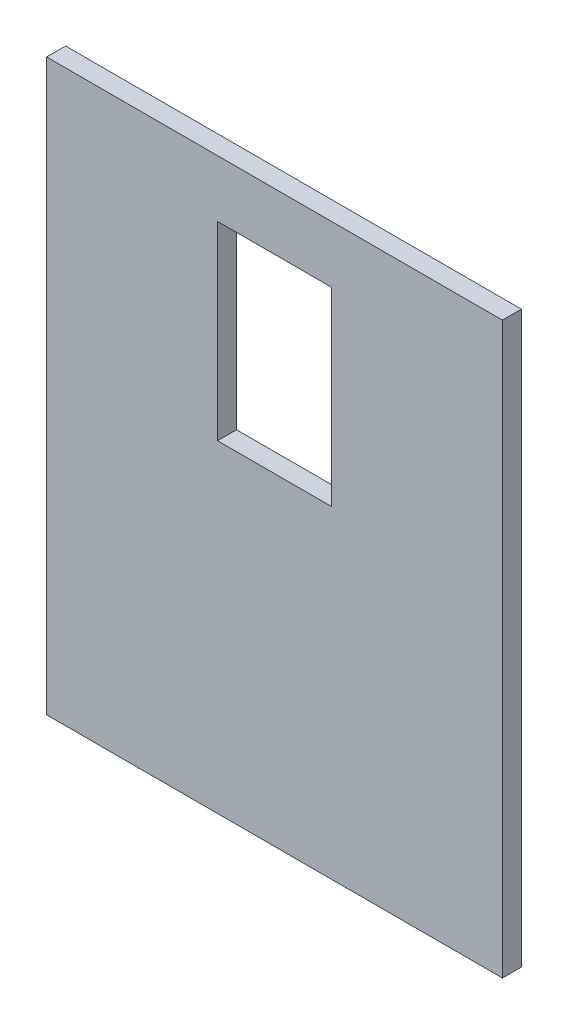
ISO-10303-21;
HEADER;
FILE_DESCRIPTION(('STEP AP214'),'2;1');
FILE_NAME('part.step','',(''),(''),'','','');
FILE_SCHEMA(('AUTOMOTIVE_DESIGN { 1 0 10303 214 1 1 1 1 }'));
ENDSEC;
DATA;
#1=APPLICATION_CONTEXT('core data for automotive mechanical design processes');
#2=APPLICATION_PROTOCOL_DEFINITION('international standard','automotive_design',2000,#1);
#3=PRODUCT_CONTEXT('',#1,'mechanical');
#4=PRODUCT('Part','Part','',(#3));
#5=PRODUCT_RELATED_PRODUCT_CATEGORY('part','',(#4));
#6=PRODUCT_DEFINITION_FORMATION('','',#4);
#7=PRODUCT_DEFINITION_CONTEXT('part definition',#1,'design');
#8=PRODUCT_DEFINITION('design','',#6,#7);
#9=PRODUCT_DEFINITION_SHAPE('','',#8);
#10=(LENGTH_UNIT() NAMED_UNIT(*) SI_UNIT(.MILLI.,.METRE.));
#11=(NAMED_UNIT(*) PLANE_ANGLE_UNIT() SI_UNIT($,.RADIAN.));
#12=(NAMED_UNIT(*) SI_UNIT($,.STERADIAN.) SOLID_ANGLE_UNIT());
#13=UNCERTAINTY_MEASURE_WITH_UNIT(LENGTH_MEASURE(1.E-05),#10,'distance_accuracy_value','');
#14=(GEOMETRIC_REPRESENTATION_CONTEXT(3) GLOBAL_UNCERTAINTY_ASSIGNED_CONTEXT((#13)) GLOBAL_UNIT_ASSIGNED_CONTEXT((#10,
#11,#12)) REPRESENTATION_CONTEXT('',''));
#15=CARTESIAN_POINT('',(0.,0.,0.));
#16=DIRECTION('',(0.,0.,1.));
#17=DIRECTION('',(1.,0.,0.));
#18=AXIS2_PLACEMENT_3D('',#15,#16,#17);
#19=CARTESIAN_POINT('',(60.,-75.,-5.));
#20=DIRECTION('',(1.,0.,0.));
#21=DIRECTION('',(0.,0.,-1.));
#22=AXIS2_PLACEMENT_3D('',#19,#20,#21);
#23=PLANE('',#22);
#24=DIRECTION('',(0.,1.,0.));
#25=VECTOR('',#24,1.);
#26=CARTESIAN_POINT('',(60.,-75.,0.));
#27=LINE('',#26,#25);
#28=CARTESIAN_POINT('',(60.,-75.,0.));
#29=VERTEX_POINT('',#28);
#30=CARTESIAN_POINT('',(60.,75.,0.));
#31=VERTEX_POINT('',#30);
#32=EDGE_CURVE('E148',#29,#31,#27,.T.);
#33=ORIENTED_EDGE('',*,*,#32,.F.);
#34=DIRECTION('',(0.,0.,1.));
#35=VECTOR('',#34,1.);
#36=CARTESIAN_POINT('',(60.,-75.,-5.));
#37=LINE('',#36,#35);
#38=CARTESIAN_POINT('',(60.,-75.,-5.));
#39=VERTEX_POINT('',#38);
#40=EDGE_CURVE('E11',#39,#29,#37,.T.);
#41=ORIENTED_EDGE('',*,*,#40,.F.);
#42=DIRECTION('',(0.,1.,0.));
#43=VECTOR('',#42,1.);
#44=CARTESIAN_POINT('',(60.,-75.,-5.));
#45=LINE('',#44,#43);
#46=CARTESIAN_POINT('',(60.,75.,-5.));
#47=VERTEX_POINT('',#46);
#48=EDGE_CURVE('E154',#39,#47,#45,.T.);
#49=ORIENTED_EDGE('',*,*,#48,.T.);
#50=DIRECTION('',(0.,0.,1.));
#51=VECTOR('',#50,1.);
#52=CARTESIAN_POINT('',(60.,75.,-5.));
#53=LINE('',#52,#51);
#54=EDGE_CURVE('E42',#47,#31,#53,.T.);
#55=ORIENTED_EDGE('',*,*,#54,.T.);
#56=EDGE_LOOP('',(#33,#41,#49,#55));
#57=FACE_BOUND('',#56,.T.);
#58=ADVANCED_FACE('F39',(#57),#23,.T.);
#59=CARTESIAN_POINT('',(-60.,-75.,-5.));
#60=DIRECTION('',(0.,-1.,0.));
#61=DIRECTION('',(0.,0.,-1.));
#62=AXIS2_PLACEMENT_3D('',#59,#60,#61);
#63=PLANE('',#62);
#64=DIRECTION('',(1.,0.,0.));
#65=VECTOR('',#64,1.);
#66=CARTESIAN_POINT('',(-60.,-75.,0.));
#67=LINE('',#66,#65);
#68=CARTESIAN_POINT('',(-60.,-75.,0.));
#69=VERTEX_POINT('',#68);
#70=EDGE_CURVE('E159',#69,#29,#67,.T.);
#71=ORIENTED_EDGE('',*,*,#70,.F.);
#72=DIRECTION('',(0.,0.,1.));
#73=VECTOR('',#72,1.);
#74=CARTESIAN_POINT('',(-60.,-75.,-5.));
#75=LINE('',#74,#73);
#76=CARTESIAN_POINT('',(-60.,-75.,-5.));
#77=VERTEX_POINT('',#76);
#78=EDGE_CURVE('E48',#77,#69,#75,.T.);
#79=ORIENTED_EDGE('',*,*,#78,.F.);
#80=DIRECTION('',(1.,0.,0.));
#81=VECTOR('',#80,1.);
#82=CARTESIAN_POINT('',(-60.,-75.,-5.));
#83=LINE('',#82,#81);
#84=EDGE_CURVE('E167',#77,#39,#83,.T.);
#85=ORIENTED_EDGE('',*,*,#84,.T.);
#86=ORIENTED_EDGE('',*,*,#40,.T.);
#87=EDGE_LOOP('',(#71,#79,#85,#86));
#88=FACE_BOUND('',#87,.T.);
#89=ADVANCED_FACE('F201',(#88),#63,.T.);
#90=CARTESIAN_POINT('',(-60.,-75.,-5.));
#91=DIRECTION('',(-1.,0.,0.));
#92=DIRECTION('',(0.,0.,1.));
#93=AXIS2_PLACEMENT_3D('',#90,#91,#92);
#94=PLANE('',#93);
#95=DIRECTION('',(0.,-1.,0.));
#96=VECTOR('',#95,1.);
#97=CARTESIAN_POINT('',(-60.,-75.,0.));
#98=LINE('',#97,#96);
#99=CARTESIAN_POINT('',(-60.,75.,0.));
#100=VERTEX_POINT('',#99);
#101=EDGE_CURVE('E178',#100,#69,#98,.T.);
#102=ORIENTED_EDGE('',*,*,#101,.F.);
#103=DIRECTION('',(0.,0.,1.));
#104=VECTOR('',#103,1.);
#105=CARTESIAN_POINT('',(-60.,75.,-5.));
#106=LINE('',#105,#104);
#107=CARTESIAN_POINT('',(-60.,75.,-5.));
#108=VERTEX_POINT('',#107);
#109=EDGE_CURVE('E186',#108,#100,#106,.T.);
#110=ORIENTED_EDGE('',*,*,#109,.F.);
#111=DIRECTION('',(0.,-1.,0.));
#112=VECTOR('',#111,1.);
#113=CARTESIAN_POINT('',(-60.,-75.,-5.));
#114=LINE('',#113,#112);
#115=EDGE_CURVE('E163',#108,#77,#114,.T.);
#116=ORIENTED_EDGE('',*,*,#115,.T.);
#117=ORIENTED_EDGE('',*,*,#78,.T.);
#118=EDGE_LOOP('',(#102,#110,#116,#117));
#119=FACE_BOUND('',#118,.T.);
#120=ADVANCED_FACE('F205',(#119),#94,.T.);
#121=CARTESIAN_POINT('',(-60.,75.,-5.));
#122=DIRECTION('',(0.,1.,0.));
#123=DIRECTION('',(0.,0.,1.));
#124=AXIS2_PLACEMENT_3D('',#121,#122,#123);
#125=PLANE('',#124);
#126=DIRECTION('',(-1.,0.,0.));
#127=VECTOR('',#126,1.);
#128=CARTESIAN_POINT('',(-60.,75.,0.));
#129=LINE('',#128,#127);
#130=EDGE_CURVE('E174',#31,#100,#129,.T.);
#131=ORIENTED_EDGE('',*,*,#130,.F.);
#132=ORIENTED_EDGE('',*,*,#54,.F.);
#133=DIRECTION('',(-1.,0.,0.));
#134=VECTOR('',#133,1.);
#135=CARTESIAN_POINT('',(-60.,75.,-5.));
#136=LINE('',#135,#134);
#137=EDGE_CURVE('E158',#47,#108,#136,.T.);
#138=ORIENTED_EDGE('',*,*,#137,.T.);
#139=ORIENTED_EDGE('',*,*,#109,.T.);
#140=EDGE_LOOP('',(#131,#132,#138,#139));
#141=FACE_BOUND('',#140,.T.);
#142=ADVANCED_FACE('F196',(#141),#125,.T.);
#143=CARTESIAN_POINT('',(0.,0.,-5.));
#144=DIRECTION('',(0.,0.,-1.));
#145=DIRECTION('',(-1.,0.,0.));
#146=AXIS2_PLACEMENT_3D('',#143,#144,#145);
#147=PLANE('',#146);
#148=DIRECTION('',(0.,1.,0.));
#149=VECTOR('',#148,1.);
#150=CARTESIAN_POINT('',(15.,9.99999999999998,-5.));
#151=LINE('',#150,#149);
#152=CARTESIAN_POINT('',(15.,9.99999999999998,-5.));
#153=VERTEX_POINT('',#152);
#154=CARTESIAN_POINT('',(15.,60.,-5.));
#155=VERTEX_POINT('',#154);
#156=EDGE_CURVE('E107',#153,#155,#151,.T.);
#157=ORIENTED_EDGE('',*,*,#156,.T.);
#158=DIRECTION('',(-1.,0.,0.));
#159=VECTOR('',#158,1.);
#160=CARTESIAN_POINT('',(-15.,60.,-5.));
#161=LINE('',#160,#159);
#162=CARTESIAN_POINT('',(-15.,60.,-5.));
#163=VERTEX_POINT('',#162);
#164=EDGE_CURVE('E117',#155,#163,#161,.T.);
#165=ORIENTED_EDGE('',*,*,#164,.T.);
#166=DIRECTION('',(0.,-1.,0.));
#167=VECTOR('',#166,1.);
#168=CARTESIAN_POINT('',(-15.,9.99999999999998,-5.));
#169=LINE('',#168,#167);
#170=CARTESIAN_POINT('',(-15.,9.99999999999998,-5.));
#171=VERTEX_POINT('',#170);
#172=EDGE_CURVE('E56',#163,#171,#169,.T.);
#173=ORIENTED_EDGE('',*,*,#172,.T.);
#174=DIRECTION('',(1.,0.,0.));
#175=VECTOR('',#174,1.);
#176=CARTESIAN_POINT('',(-15.,9.99999999999998,-5.));
#177=LINE('',#176,#175);
#178=EDGE_CURVE('E114',#171,#153,#177,.T.);
#179=ORIENTED_EDGE('',*,*,#178,.T.);
#180=EDGE_LOOP('',(#157,#165,#173,#179));
#181=FACE_BOUND('',#180,.T.);
#182=ORIENTED_EDGE('',*,*,#48,.F.);
#183=ORIENTED_EDGE('',*,*,#84,.F.);
#184=ORIENTED_EDGE('',*,*,#115,.F.);
#185=ORIENTED_EDGE('',*,*,#137,.F.);
#186=EDGE_LOOP('',(#182,#183,#184,#185));
#187=FACE_BOUND('',#186,.T.);
#188=ADVANCED_FACE('F122',(#181,#187),#147,.T.);
#189=CARTESIAN_POINT('',(0.,0.,0.));
#190=DIRECTION('',(0.,0.,-1.));
#191=DIRECTION('',(-1.,0.,0.));
#192=AXIS2_PLACEMENT_3D('',#189,#190,#191);
#193=PLANE('',#192);
#194=DIRECTION('',(-1.,0.,0.));
#195=VECTOR('',#194,1.);
#196=CARTESIAN_POINT('',(-15.,60.,0.));
#197=LINE('',#196,#195);
#198=CARTESIAN_POINT('',(15.,60.,0.));
#199=VERTEX_POINT('',#198);
#200=CARTESIAN_POINT('',(-15.,60.,0.));
#201=VERTEX_POINT('',#200);
#202=EDGE_CURVE('E139',#199,#201,#197,.T.);
#203=ORIENTED_EDGE('',*,*,#202,.F.);
#204=DIRECTION('',(0.,1.,0.));
#205=VECTOR('',#204,1.);
#206=CARTESIAN_POINT('',(15.,9.99999999999998,0.));
#207=LINE('',#206,#205);
#208=CARTESIAN_POINT('',(15.,9.99999999999998,0.));
#209=VERTEX_POINT('',#208);
#210=EDGE_CURVE('E64',#209,#199,#207,.T.);
#211=ORIENTED_EDGE('',*,*,#210,.F.);
#212=DIRECTION('',(1.,0.,0.));
#213=VECTOR('',#212,1.);
#214=CARTESIAN_POINT('',(-15.,9.99999999999998,0.));
#215=LINE('',#214,#213);
#216=CARTESIAN_POINT('',(-15.,9.99999999999998,0.));
#217=VERTEX_POINT('',#216);
#218=EDGE_CURVE('E126',#217,#209,#215,.T.);
#219=ORIENTED_EDGE('',*,*,#218,.F.);
#220=DIRECTION('',(0.,-1.,0.));
#221=VECTOR('',#220,1.);
#222=CARTESIAN_POINT('',(-15.,9.99999999999998,0.));
#223=LINE('',#222,#221);
#224=EDGE_CURVE('E130',#201,#217,#223,.T.);
#225=ORIENTED_EDGE('',*,*,#224,.F.);
#226=EDGE_LOOP('',(#203,#211,#219,#225));
#227=FACE_BOUND('',#226,.T.);
#228=ORIENTED_EDGE('',*,*,#32,.T.);
#229=ORIENTED_EDGE('',*,*,#130,.T.);
#230=ORIENTED_EDGE('',*,*,#101,.T.);
#231=ORIENTED_EDGE('',*,*,#70,.T.);
#232=EDGE_LOOP('',(#228,#229,#230,#231));
#233=FACE_BOUND('',#232,.T.);
#234=ADVANCED_FACE('F198',(#227,#233),#193,.F.);
#235=CARTESIAN_POINT('',(15.,9.99999999999998,-5.));
#236=DIRECTION('',(1.,0.,0.));
#237=DIRECTION('',(0.,0.,-1.));
#238=AXIS2_PLACEMENT_3D('',#235,#236,#237);
#239=PLANE('',#238);
#240=ORIENTED_EDGE('',*,*,#210,.T.);
#241=DIRECTION('',(0.,0.,1.));
#242=VECTOR('',#241,1.);
#243=CARTESIAN_POINT('',(15.,60.,-5.));
#244=LINE('',#243,#242);
#245=EDGE_CURVE('E103',#155,#199,#244,.T.);
#246=ORIENTED_EDGE('',*,*,#245,.F.);
#247=ORIENTED_EDGE('',*,*,#156,.F.);
#248=DIRECTION('',(0.,0.,1.));
#249=VECTOR('',#248,1.);
#250=CARTESIAN_POINT('',(15.,9.99999999999998,-5.));
#251=LINE('',#250,#249);
#252=EDGE_CURVE('E145',#153,#209,#251,.T.);
#253=ORIENTED_EDGE('',*,*,#252,.T.);
#254=EDGE_LOOP('',(#240,#246,#247,#253));
#255=FACE_BOUND('',#254,.T.);
#256=ADVANCED_FACE('F105',(#255),#239,.F.);
#257=CARTESIAN_POINT('',(-15.,9.99999999999998,-5.));
#258=DIRECTION('',(0.,-1.,0.));
#259=DIRECTION('',(0.,0.,-1.));
#260=AXIS2_PLACEMENT_3D('',#257,#258,#259);
#261=PLANE('',#260);
#262=ORIENTED_EDGE('',*,*,#218,.T.);
#263=ORIENTED_EDGE('',*,*,#252,.F.);
#264=ORIENTED_EDGE('',*,*,#178,.F.);
#265=DIRECTION('',(0.,0.,1.));
#266=VECTOR('',#265,1.);
#267=CARTESIAN_POINT('',(-15.,9.99999999999998,-5.));
#268=LINE('',#267,#266);
#269=EDGE_CURVE('E149',#171,#217,#268,.T.);
#270=ORIENTED_EDGE('',*,*,#269,.T.);
#271=EDGE_LOOP('',(#262,#263,#264,#270));
#272=FACE_BOUND('',#271,.T.);
#273=ADVANCED_FACE('F256',(#272),#261,.F.);
#274=CARTESIAN_POINT('',(-15.,9.99999999999998,-5.));
#275=DIRECTION('',(-1.,0.,0.));
#276=DIRECTION('',(0.,0.,1.));
#277=AXIS2_PLACEMENT_3D('',#274,#275,#276);
#278=PLANE('',#277);
#279=ORIENTED_EDGE('',*,*,#224,.T.);
#280=ORIENTED_EDGE('',*,*,#269,.F.);
#281=ORIENTED_EDGE('',*,*,#172,.F.);
#282=DIRECTION('',(0.,0.,1.));
#283=VECTOR('',#282,1.);
#284=CARTESIAN_POINT('',(-15.,60.,-5.));
#285=LINE('',#284,#283);
#286=EDGE_CURVE('E113',#163,#201,#285,.T.);
#287=ORIENTED_EDGE('',*,*,#286,.T.);
#288=EDGE_LOOP('',(#279,#280,#281,#287));
#289=FACE_BOUND('',#288,.T.);
#290=ADVANCED_FACE('F265',(#289),#278,.F.);
#291=CARTESIAN_POINT('',(-15.,60.,-5.));
#292=DIRECTION('',(0.,1.,0.));
#293=DIRECTION('',(0.,0.,1.));
#294=AXIS2_PLACEMENT_3D('',#291,#292,#293);
#295=PLANE('',#294);
#296=ORIENTED_EDGE('',*,*,#202,.T.);
#297=ORIENTED_EDGE('',*,*,#286,.F.);
#298=ORIENTED_EDGE('',*,*,#164,.F.);
#299=ORIENTED_EDGE('',*,*,#245,.T.);
#300=EDGE_LOOP('',(#296,#297,#298,#299));
#301=FACE_BOUND('',#300,.T.);
#302=ADVANCED_FACE('F118',(#301),#295,.F.);
#303=CLOSED_SHELL('',(#58,#89,#120,#142,#188,#234,#256,#273,#290,#302));
#304=MANIFOLD_SOLID_BREP('B2',#303);
#305=ADVANCED_BREP_SHAPE_REPRESENTATION('',(#18,#304),#14);
#306=SHAPE_DEFINITION_REPRESENTATION(#9,#305);
ENDSEC;
END-ISO-10303-21;
